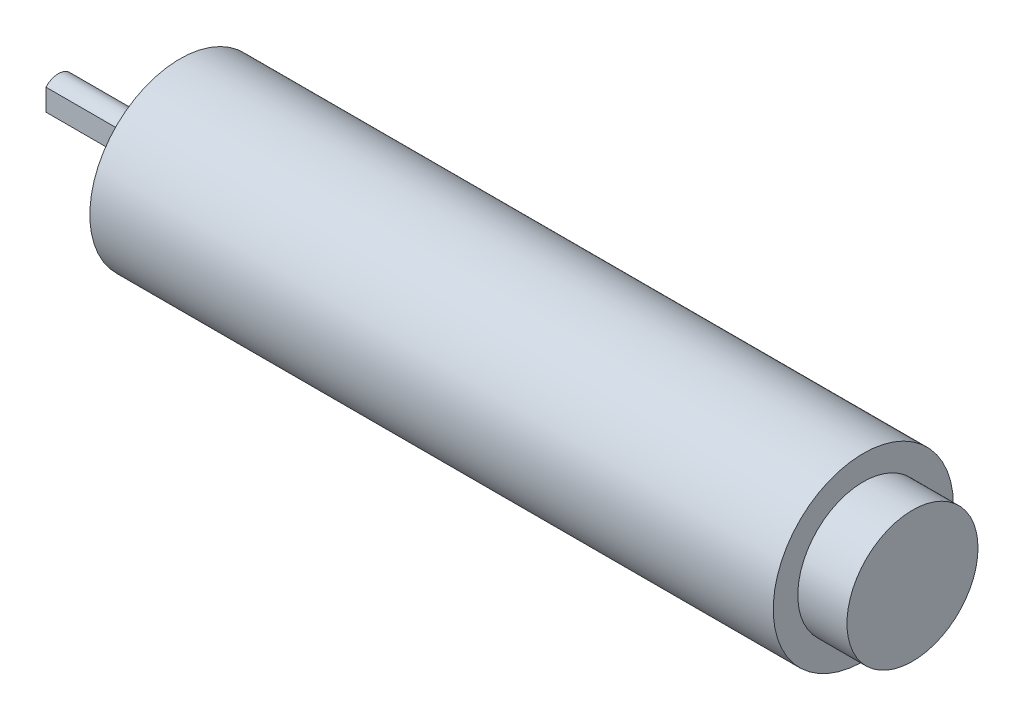
ISO-10303-21;
HEADER;
FILE_DESCRIPTION(('STEP AP214'),'2;1');
FILE_NAME('part.step','',(''),(''),'','','');
FILE_SCHEMA(('AUTOMOTIVE_DESIGN { 1 0 10303 214 1 1 1 1 }'));
ENDSEC;
DATA;
#1=APPLICATION_CONTEXT('core data for automotive mechanical design processes');
#2=APPLICATION_PROTOCOL_DEFINITION('international standard','automotive_design',2000,#1);
#3=PRODUCT_CONTEXT('',#1,'mechanical');
#4=PRODUCT('Part','Part','',(#3));
#5=PRODUCT_RELATED_PRODUCT_CATEGORY('part','',(#4));
#6=PRODUCT_DEFINITION_FORMATION('','',#4);
#7=PRODUCT_DEFINITION_CONTEXT('part definition',#1,'design');
#8=PRODUCT_DEFINITION('design','',#6,#7);
#9=PRODUCT_DEFINITION_SHAPE('','',#8);
#10=(LENGTH_UNIT() NAMED_UNIT(*) SI_UNIT(.MILLI.,.METRE.));
#11=(NAMED_UNIT(*) PLANE_ANGLE_UNIT() SI_UNIT($,.RADIAN.));
#12=(NAMED_UNIT(*) SI_UNIT($,.STERADIAN.) SOLID_ANGLE_UNIT());
#13=UNCERTAINTY_MEASURE_WITH_UNIT(LENGTH_MEASURE(1.E-05),#10,'distance_accuracy_value','');
#14=(GEOMETRIC_REPRESENTATION_CONTEXT(3) GLOBAL_UNCERTAINTY_ASSIGNED_CONTEXT((#13)) GLOBAL_UNIT_ASSIGNED_CONTEXT((#10,
#11,#12)) REPRESENTATION_CONTEXT('',''));
#15=CARTESIAN_POINT('',(0.,0.,0.));
#16=DIRECTION('',(0.,0.,1.));
#17=DIRECTION('',(1.,0.,0.));
#18=AXIS2_PLACEMENT_3D('',#15,#16,#17);
#19=CARTESIAN_POINT('',(0.,0.,0.));
#20=DIRECTION('',(1.,0.,0.));
#21=DIRECTION('',(0.,0.,-1.));
#22=AXIS2_PLACEMENT_3D('',#19,#20,#21);
#23=CYLINDRICAL_SURFACE('',#22,11.);
#24=CARTESIAN_POINT('',(0.,0.,0.));
#25=DIRECTION('',(1.,0.,0.));
#26=DIRECTION('',(0.,0.,-1.));
#27=AXIS2_PLACEMENT_3D('',#24,#25,#26);
#28=CIRCLE('',#27,11.);
#29=CARTESIAN_POINT('',(0.,0.,-11.));
#30=VERTEX_POINT('',#29);
#31=EDGE_CURVE('E11',#30,#30,#28,.T.);
#32=ORIENTED_EDGE('',*,*,#31,.T.);
#33=EDGE_LOOP('',(#32));
#34=FACE_BOUND('',#33,.T.);
#35=CARTESIAN_POINT('',(83.43,0.,0.));
#36=DIRECTION('',(1.,0.,0.));
#37=DIRECTION('',(0.,0.,-1.));
#38=AXIS2_PLACEMENT_3D('',#35,#36,#37);
#39=CIRCLE('',#38,11.);
#40=CARTESIAN_POINT('',(83.43,0.,-11.));
#41=VERTEX_POINT('',#40);
#42=EDGE_CURVE('E40',#41,#41,#39,.F.);
#43=ORIENTED_EDGE('',*,*,#42,.T.);
#44=EDGE_LOOP('',(#43));
#45=FACE_BOUND('',#44,.T.);
#46=ADVANCED_FACE('F37',(#34,#45),#23,.T.);
#47=CARTESIAN_POINT('',(-3.15,0.,0.));
#48=DIRECTION('',(-1.,0.,0.));
#49=DIRECTION('',(0.,0.,1.));
#50=AXIS2_PLACEMENT_3D('',#47,#48,#49);
#51=PLANE('',#50);
#52=CARTESIAN_POINT('',(-3.15,0.,0.));
#53=DIRECTION('',(-1.,0.,0.));
#54=DIRECTION('',(0.,0.,1.));
#55=AXIS2_PLACEMENT_3D('',#52,#53,#54);
#56=CIRCLE('',#55,3.5);
#57=CARTESIAN_POINT('',(-3.15,0.,3.5));
#58=VERTEX_POINT('',#57);
#59=EDGE_CURVE('E88',#58,#58,#56,.T.);
#60=ORIENTED_EDGE('',*,*,#59,.T.);
#61=EDGE_LOOP('',(#60));
#62=FACE_BOUND('',#61,.T.);
#63=CARTESIAN_POINT('',(-3.15,0.,0.));
#64=DIRECTION('',(-1.,0.,0.));
#65=DIRECTION('',(0.,0.,1.));
#66=AXIS2_PLACEMENT_3D('',#63,#64,#65);
#67=CIRCLE('',#66,2.);
#68=CARTESIAN_POINT('',(-3.15,0.,2.));
#69=VERTEX_POINT('',#68);
#70=EDGE_CURVE('E79',#69,#69,#67,.T.);
#71=ORIENTED_EDGE('',*,*,#70,.F.);
#72=EDGE_LOOP('',(#71));
#73=FACE_BOUND('',#72,.T.);
#74=ADVANCED_FACE('F112',(#62,#73),#51,.T.);
#75=CARTESIAN_POINT('',(-1.35,0.,0.));
#76=DIRECTION('',(-1.,0.,0.));
#77=DIRECTION('',(0.,0.,1.));
#78=AXIS2_PLACEMENT_3D('',#75,#76,#77);
#79=PLANE('',#78);
#80=CARTESIAN_POINT('',(-1.35,0.,0.));
#81=DIRECTION('',(-1.,0.,0.));
#82=DIRECTION('',(0.,0.,1.));
#83=AXIS2_PLACEMENT_3D('',#80,#81,#82);
#84=CIRCLE('',#83,5.);
#85=CARTESIAN_POINT('',(-1.35,0.,-5.));
#86=VERTEX_POINT('',#85);
#87=EDGE_CURVE('E46',#86,#86,#84,.T.);
#88=ORIENTED_EDGE('',*,*,#87,.T.);
#89=EDGE_LOOP('',(#88));
#90=FACE_BOUND('',#89,.T.);
#91=CARTESIAN_POINT('',(-1.35,0.,0.));
#92=DIRECTION('',(-1.,0.,0.));
#93=DIRECTION('',(0.,0.,1.));
#94=AXIS2_PLACEMENT_3D('',#91,#92,#93);
#95=CIRCLE('',#94,3.5);
#96=CARTESIAN_POINT('',(-1.35,0.,3.5));
#97=VERTEX_POINT('',#96);
#98=EDGE_CURVE('E85',#97,#97,#95,.T.);
#99=ORIENTED_EDGE('',*,*,#98,.F.);
#100=EDGE_LOOP('',(#99));
#101=FACE_BOUND('',#100,.T.);
#102=ADVANCED_FACE('F103',(#90,#101),#79,.T.);
#103=CARTESIAN_POINT('',(0.,11.,0.));
#104=DIRECTION('',(-1.,0.,0.));
#105=DIRECTION('',(0.,0.,1.));
#106=AXIS2_PLACEMENT_3D('',#103,#104,#105);
#107=PLANE('',#106);
#108=CARTESIAN_POINT('',(0.,6.06217782649,-3.5));
#109=DIRECTION('',(-1.,0.,0.));
#110=DIRECTION('',(0.,0.,1.));
#111=AXIS2_PLACEMENT_3D('',#108,#109,#110);
#112=CIRCLE('',#111,0.975000000000014);
#113=CARTESIAN_POINT('',(0.,6.06217782649,-2.52499999999999));
#114=VERTEX_POINT('',#113);
#115=EDGE_CURVE('E162',#114,#114,#112,.T.);
#116=ORIENTED_EDGE('',*,*,#115,.F.);
#117=EDGE_LOOP('',(#116));
#118=FACE_BOUND('',#117,.T.);
#119=CARTESIAN_POINT('',(0.,-6.06217782649,-3.5));
#120=DIRECTION('',(-1.,0.,0.));
#121=DIRECTION('',(0.,0.,1.));
#122=AXIS2_PLACEMENT_3D('',#119,#120,#121);
#123=CIRCLE('',#122,0.975000000000014);
#124=CARTESIAN_POINT('',(0.,-6.06217782649,-2.52499999999999));
#125=VERTEX_POINT('',#124);
#126=EDGE_CURVE('E168',#125,#125,#123,.T.);
#127=ORIENTED_EDGE('',*,*,#126,.F.);
#128=EDGE_LOOP('',(#127));
#129=FACE_BOUND('',#128,.T.);
#130=CARTESIAN_POINT('',(0.,0.,7.));
#131=DIRECTION('',(-1.,0.,0.));
#132=DIRECTION('',(0.,0.,1.));
#133=AXIS2_PLACEMENT_3D('',#130,#131,#132);
#134=CIRCLE('',#133,0.975000000000014);
#135=CARTESIAN_POINT('',(0.,0.,7.97500000000001));
#136=VERTEX_POINT('',#135);
#137=EDGE_CURVE('E174',#136,#136,#134,.T.);
#138=ORIENTED_EDGE('',*,*,#137,.F.);
#139=EDGE_LOOP('',(#138));
#140=FACE_BOUND('',#139,.T.);
#141=ORIENTED_EDGE('',*,*,#31,.F.);
#142=EDGE_LOOP('',(#141));
#143=FACE_BOUND('',#142,.T.);
#144=CARTESIAN_POINT('',(0.,0.,0.));
#145=DIRECTION('',(-1.,0.,0.));
#146=DIRECTION('',(0.,0.,1.));
#147=AXIS2_PLACEMENT_3D('',#144,#145,#146);
#148=CIRCLE('',#147,5.);
#149=CARTESIAN_POINT('',(0.,0.,-5.));
#150=VERTEX_POINT('',#149);
#151=EDGE_CURVE('E91',#150,#150,#148,.T.);
#152=ORIENTED_EDGE('',*,*,#151,.F.);
#153=EDGE_LOOP('',(#152));
#154=FACE_BOUND('',#153,.T.);
#155=ADVANCED_FACE('F101',(#118,#129,#140,#143,#154),#107,.T.);
#156=CARTESIAN_POINT('',(-1.35,0.,0.));
#157=DIRECTION('',(1.,0.,0.));
#158=DIRECTION('',(0.,0.,-1.));
#159=AXIS2_PLACEMENT_3D('',#156,#157,#158);
#160=CYLINDRICAL_SURFACE('',#159,5.);
#161=CARTESIAN_POINT('',(-1.35,0.,-5.));
#162=CARTESIAN_POINT('',(-1.3359375,0.,-5.));
#163=CARTESIAN_POINT('',(-1.321875,0.,-5.));
#164=CARTESIAN_POINT('',(-1.29375,0.,-5.));
#165=CARTESIAN_POINT('',(-1.2796875,0.,-5.));
#166=CARTESIAN_POINT('',(-1.2515625,0.,-5.));
#167=CARTESIAN_POINT('',(-1.2375,0.,-5.));
#168=CARTESIAN_POINT('',(-1.209375,0.,-5.));
#169=CARTESIAN_POINT('',(-1.1953125,0.,-5.));
#170=CARTESIAN_POINT('',(-1.1671875,0.,-5.));
#171=CARTESIAN_POINT('',(-1.153125,0.,-5.));
#172=CARTESIAN_POINT('',(-1.125,0.,-5.));
#173=CARTESIAN_POINT('',(-1.1109375,0.,-5.));
#174=CARTESIAN_POINT('',(-1.0828125,0.,-5.));
#175=CARTESIAN_POINT('',(-1.06875,0.,-5.));
#176=CARTESIAN_POINT('',(-1.040625,0.,-5.));
#177=CARTESIAN_POINT('',(-1.0265625,0.,-5.));
#178=CARTESIAN_POINT('',(-0.9984375,0.,-5.));
#179=CARTESIAN_POINT('',(-0.984375,0.,-5.));
#180=CARTESIAN_POINT('',(-0.95625,0.,-5.));
#181=CARTESIAN_POINT('',(-0.9421875,0.,-5.));
#182=CARTESIAN_POINT('',(-0.9140625,0.,-5.));
#183=CARTESIAN_POINT('',(-0.9,0.,-5.));
#184=CARTESIAN_POINT('',(-0.871875,0.,-5.));
#185=CARTESIAN_POINT('',(-0.8578125,0.,-5.));
#186=CARTESIAN_POINT('',(-0.8296875,0.,-5.));
#187=CARTESIAN_POINT('',(-0.815625,0.,-5.));
#188=CARTESIAN_POINT('',(-0.7875,0.,-5.));
#189=CARTESIAN_POINT('',(-0.7734375,0.,-5.));
#190=CARTESIAN_POINT('',(-0.7453125,0.,-5.));
#191=CARTESIAN_POINT('',(-0.73125,0.,-5.));
#192=CARTESIAN_POINT('',(-0.703125,0.,-5.));
#193=CARTESIAN_POINT('',(-0.6890625,0.,-5.));
#194=CARTESIAN_POINT('',(-0.6609375,0.,-5.));
#195=CARTESIAN_POINT('',(-0.646875,0.,-5.));
#196=CARTESIAN_POINT('',(-0.61875,0.,-5.));
#197=CARTESIAN_POINT('',(-0.6046875,0.,-5.));
#198=CARTESIAN_POINT('',(-0.5765625,0.,-5.));
#199=CARTESIAN_POINT('',(-0.5625,0.,-5.));
#200=CARTESIAN_POINT('',(-0.534375,0.,-5.));
#201=CARTESIAN_POINT('',(-0.5203125,0.,-5.));
#202=CARTESIAN_POINT('',(-0.4921875,0.,-5.));
#203=CARTESIAN_POINT('',(-0.478125,0.,-5.));
#204=CARTESIAN_POINT('',(-0.45,0.,-5.));
#205=CARTESIAN_POINT('',(-0.4359375,0.,-5.));
#206=CARTESIAN_POINT('',(-0.4078125,0.,-5.));
#207=CARTESIAN_POINT('',(-0.39375,0.,-5.));
#208=CARTESIAN_POINT('',(-0.365625,0.,-5.));
#209=CARTESIAN_POINT('',(-0.3515625,0.,-5.));
#210=CARTESIAN_POINT('',(-0.3234375,0.,-5.));
#211=CARTESIAN_POINT('',(-0.309375,0.,-5.));
#212=CARTESIAN_POINT('',(-0.28125,0.,-5.));
#213=CARTESIAN_POINT('',(-0.2671875,0.,-5.));
#214=CARTESIAN_POINT('',(-0.2390625,0.,-5.));
#215=CARTESIAN_POINT('',(-0.225,0.,-5.));
#216=CARTESIAN_POINT('',(-0.196875,0.,-5.));
#217=CARTESIAN_POINT('',(-0.1828125,0.,-5.));
#218=CARTESIAN_POINT('',(-0.1546875,0.,-5.));
#219=CARTESIAN_POINT('',(-0.140625,0.,-5.));
#220=CARTESIAN_POINT('',(-0.1125,0.,-5.));
#221=CARTESIAN_POINT('',(-0.0984374999999998,0.,-5.));
#222=CARTESIAN_POINT('',(-0.0703124999999998,0.,-5.));
#223=CARTESIAN_POINT('',(-0.0562499999999997,0.,-5.));
#224=CARTESIAN_POINT('',(-0.0281249999999997,0.,-5.));
#225=CARTESIAN_POINT('',(-0.0140624999999997,0.,-5.));
#226=CARTESIAN_POINT('',(0.,0.,-5.));
#227=B_SPLINE_CURVE_WITH_KNOTS('',3,(#161,#162,#163,#164,#165,#166,#167,#168,#169,#170,#171,
#172,#173,#174,#175,#176,#177,#178,#179,#180,#181,#182,#183,#184,#185,#186,#187,#188,#189,#190,
#191,#192,#193,#194,#195,#196,#197,#198,#199,#200,#201,#202,#203,#204,#205,#206,#207,#208,#209,
#210,#211,#212,#213,#214,#215,#216,#217,#218,#219,#220,#221,#222,#223,#224,#225,#226),
.UNSPECIFIED.,.F.,.F.,(4,2,2,2,2,2,2,2,2,2,2,2,2,2,2,2,2,2,2,2,2,2,2,2,2,2,2,2,2,2,2,2,4),(0.,
0.0421875000000001,0.084375,0.1265625,0.16875,0.2109375,0.253125,0.2953125,0.3375,0.3796875,
0.421875,0.4640625,0.50625,0.5484375,0.590625,0.6328125,0.675,0.7171875,0.759375,0.8015625,
0.84375,0.8859375,0.928125,0.9703125,1.0125,1.0546875,1.096875,1.1390625,1.18125,1.2234375,
1.265625,1.3078125,1.35),.UNSPECIFIED.);
#228=EDGE_CURVE('BSEAM99',#86,#150,#227,.T.);
#229=ORIENTED_EDGE('',*,*,#87,.F.);
#230=ORIENTED_EDGE('',*,*,#151,.T.);
#231=ORIENTED_EDGE('',*,*,#228,.T.);
#232=ORIENTED_EDGE('',*,*,#228,.F.);
#233=EDGE_LOOP('',(#229,#231,#230,#232));
#234=FACE_BOUND('',#233,.T.);
#235=ADVANCED_FACE('F99',(#234),#160,.T.);
#236=CARTESIAN_POINT('',(-3.15,0.,0.));
#237=DIRECTION('',(1.,0.,0.));
#238=DIRECTION('',(0.,0.,-1.));
#239=AXIS2_PLACEMENT_3D('',#236,#237,#238);
#240=CYLINDRICAL_SURFACE('',#239,3.5);
#241=ORIENTED_EDGE('',*,*,#59,.F.);
#242=EDGE_LOOP('',(#241));
#243=FACE_BOUND('',#242,.T.);
#244=ORIENTED_EDGE('',*,*,#98,.T.);
#245=EDGE_LOOP('',(#244));
#246=FACE_BOUND('',#245,.T.);
#247=ADVANCED_FACE('F109',(#243,#246),#240,.T.);
#248=CARTESIAN_POINT('',(-14.85,0.,0.));
#249=DIRECTION('',(1.,0.,0.));
#250=DIRECTION('',(0.,0.,-1.));
#251=AXIS2_PLACEMENT_3D('',#248,#249,#250);
#252=CYLINDRICAL_SURFACE('',#251,2.);
#253=CARTESIAN_POINT('',(-14.85,0.,0.));
#254=DIRECTION('',(-1.,0.,0.));
#255=DIRECTION('',(0.,0.,1.));
#256=AXIS2_PLACEMENT_3D('',#253,#254,#255);
#257=CIRCLE('',#256,2.);
#258=CARTESIAN_POINT('',(-14.85,1.32287565553165,1.50000000000057));
#259=VERTEX_POINT('',#258);
#260=CARTESIAN_POINT('',(-14.85,-1.32287565553165,1.50000000000057));
#261=VERTEX_POINT('',#260);
#262=EDGE_CURVE('E83',#259,#261,#257,.T.);
#263=ORIENTED_EDGE('',*,*,#262,.F.);
#264=DIRECTION('',(-1.,0.,0.));
#265=VECTOR('',#264,1.);
#266=CARTESIAN_POINT('',(-2.34976552175177,1.32287565553165,1.50000000000057));
#267=LINE('',#266,#265);
#268=CARTESIAN_POINT('',(-5.84999999999943,1.32287565553165,1.50000000000057));
#269=VERTEX_POINT('',#268);
#270=EDGE_CURVE('E53',#269,#259,#267,.T.);
#271=ORIENTED_EDGE('',*,*,#270,.F.);
#272=CARTESIAN_POINT('',(-7.35,0.,0.));
#273=DIRECTION('',(0.707106781186547,0.,-0.707106781186548));
#274=DIRECTION('',(-0.707106781186548,0.,-0.707106781186547));
#275=AXIS2_PLACEMENT_3D('',#272,#273,#274);
#276=ELLIPSE('',#275,2.82842712474619,2.);
#277=CARTESIAN_POINT('',(-5.84999999999943,-1.32287565553165,1.50000000000057));
#278=VERTEX_POINT('',#277);
#279=EDGE_CURVE('E71',#278,#269,#276,.F.);
#280=ORIENTED_EDGE('',*,*,#279,.F.);
#281=DIRECTION('',(-1.,0.,0.));
#282=VECTOR('',#281,1.);
#283=CARTESIAN_POINT('',(-2.34976552175177,-1.32287565553165,1.50000000000057));
#284=LINE('',#283,#282);
#285=EDGE_CURVE('E62',#278,#261,#284,.T.);
#286=ORIENTED_EDGE('',*,*,#285,.T.);
#287=EDGE_LOOP('',(#263,#271,#280,#286));
#288=FACE_BOUND('',#287,.T.);
#289=ORIENTED_EDGE('',*,*,#70,.T.);
#290=EDGE_LOOP('',(#289));
#291=FACE_BOUND('',#290,.T.);
#292=ADVANCED_FACE('F76',(#288,#291),#252,.T.);
#293=CARTESIAN_POINT('',(-14.85,0.,0.));
#294=DIRECTION('',(-1.,0.,0.));
#295=DIRECTION('',(0.,0.,1.));
#296=AXIS2_PLACEMENT_3D('',#293,#294,#295);
#297=PLANE('',#296);
#298=DIRECTION('',(0.,-1.,0.));
#299=VECTOR('',#298,1.);
#300=CARTESIAN_POINT('',(-14.85,1.32287565553165,1.50000000000057));
#301=LINE('',#300,#299);
#302=EDGE_CURVE('E58',#259,#261,#301,.T.);
#303=ORIENTED_EDGE('',*,*,#302,.F.);
#304=ORIENTED_EDGE('',*,*,#262,.T.);
#305=EDGE_LOOP('',(#303,#304));
#306=FACE_BOUND('',#305,.T.);
#307=ADVANCED_FACE('F205',(#306),#297,.T.);
#308=CARTESIAN_POINT('',(-3.675,0.,3.675));
#309=DIRECTION('',(0.707106781186547,0.,-0.707106781186548));
#310=DIRECTION('',(-0.707106781186548,0.,-0.707106781186547));
#311=AXIS2_PLACEMENT_3D('',#308,#309,#310);
#312=PLANE('',#311);
#313=ORIENTED_EDGE('',*,*,#279,.T.);
#314=DIRECTION('',(0.,-1.,0.));
#315=VECTOR('',#314,1.);
#316=CARTESIAN_POINT('',(-5.84999999999943,1.32287565553165,1.50000000000057));
#317=LINE('',#316,#315);
#318=EDGE_CURVE('E65',#269,#278,#317,.T.);
#319=ORIENTED_EDGE('',*,*,#318,.T.);
#320=EDGE_LOOP('',(#313,#319));
#321=FACE_BOUND('',#320,.T.);
#322=ADVANCED_FACE('F74',(#321),#312,.F.);
#323=CARTESIAN_POINT('',(-2.34976552175177,1.32287565553165,1.50000000000057));
#324=DIRECTION('',(0.,0.,-1.));
#325=DIRECTION('',(0.,1.,0.));
#326=AXIS2_PLACEMENT_3D('',#323,#324,#325);
#327=PLANE('',#326);
#328=ORIENTED_EDGE('',*,*,#270,.T.);
#329=ORIENTED_EDGE('',*,*,#302,.T.);
#330=ORIENTED_EDGE('',*,*,#285,.F.);
#331=ORIENTED_EDGE('',*,*,#318,.F.);
#332=EDGE_LOOP('',(#328,#329,#330,#331));
#333=FACE_BOUND('',#332,.T.);
#334=ADVANCED_FACE('F64',(#333),#327,.F.);
#335=CARTESIAN_POINT('',(6.50000000000001,0.,7.));
#336=DIRECTION('',(1.,0.,0.));
#337=DIRECTION('',(0.,0.,-1.));
#338=AXIS2_PLACEMENT_3D('',#335,#336,#337);
#339=PLANE('',#338);
#340=CARTESIAN_POINT('',(6.50000000000001,0.,7.));
#341=DIRECTION('',(-1.,0.,0.));
#342=DIRECTION('',(0.,0.,1.));
#343=AXIS2_PLACEMENT_3D('',#340,#341,#342);
#344=CIRCLE('',#343,0.975000000000014);
#345=CARTESIAN_POINT('',(6.50000000000001,0.,7.97500000000001));
#346=VERTEX_POINT('',#345);
#347=EDGE_CURVE('E177',#346,#346,#344,.T.);
#348=ORIENTED_EDGE('',*,*,#347,.T.);
#349=EDGE_LOOP('',(#348));
#350=FACE_BOUND('',#349,.T.);
#351=ADVANCED_FACE('F181',(#350),#339,.F.);
#352=CARTESIAN_POINT('',(0.,0.,7.));
#353=DIRECTION('',(-1.,0.,0.));
#354=DIRECTION('',(0.,0.,1.));
#355=AXIS2_PLACEMENT_3D('',#352,#353,#354);
#356=CYLINDRICAL_SURFACE('',#355,0.975000000000014);
#357=ORIENTED_EDGE('',*,*,#347,.F.);
#358=EDGE_LOOP('',(#357));
#359=FACE_BOUND('',#358,.T.);
#360=ORIENTED_EDGE('',*,*,#137,.T.);
#361=EDGE_LOOP('',(#360));
#362=FACE_BOUND('',#361,.T.);
#363=ADVANCED_FACE('F183',(#359,#362),#356,.F.);
#364=CARTESIAN_POINT('',(6.50000000000001,-6.06217782649,-3.5));
#365=DIRECTION('',(1.,0.,0.));
#366=DIRECTION('',(0.,0.,-1.));
#367=AXIS2_PLACEMENT_3D('',#364,#365,#366);
#368=PLANE('',#367);
#369=CARTESIAN_POINT('',(6.50000000000001,-6.06217782649,-3.5));
#370=DIRECTION('',(-1.,0.,0.));
#371=DIRECTION('',(0.,0.,1.));
#372=AXIS2_PLACEMENT_3D('',#369,#370,#371);
#373=CIRCLE('',#372,0.975000000000014);
#374=CARTESIAN_POINT('',(6.50000000000001,-6.06217782649,-2.52499999999999));
#375=VERTEX_POINT('',#374);
#376=EDGE_CURVE('E171',#375,#375,#373,.T.);
#377=ORIENTED_EDGE('',*,*,#376,.T.);
#378=EDGE_LOOP('',(#377));
#379=FACE_BOUND('',#378,.T.);
#380=ADVANCED_FACE('F186',(#379),#368,.F.);
#381=CARTESIAN_POINT('',(0.,-6.06217782649,-3.5));
#382=DIRECTION('',(-1.,0.,0.));
#383=DIRECTION('',(0.,0.,1.));
#384=AXIS2_PLACEMENT_3D('',#381,#382,#383);
#385=CYLINDRICAL_SURFACE('',#384,0.975000000000014);
#386=ORIENTED_EDGE('',*,*,#376,.F.);
#387=EDGE_LOOP('',(#386));
#388=FACE_BOUND('',#387,.T.);
#389=ORIENTED_EDGE('',*,*,#126,.T.);
#390=EDGE_LOOP('',(#389));
#391=FACE_BOUND('',#390,.T.);
#392=ADVANCED_FACE('F195',(#388,#391),#385,.F.);
#393=CARTESIAN_POINT('',(6.50000000000001,6.06217782649,-3.5));
#394=DIRECTION('',(1.,0.,0.));
#395=DIRECTION('',(0.,0.,-1.));
#396=AXIS2_PLACEMENT_3D('',#393,#394,#395);
#397=PLANE('',#396);
#398=CARTESIAN_POINT('',(6.50000000000001,6.06217782649,-3.5));
#399=DIRECTION('',(-1.,0.,0.));
#400=DIRECTION('',(0.,0.,1.));
#401=AXIS2_PLACEMENT_3D('',#398,#399,#400);
#402=CIRCLE('',#401,0.975000000000014);
#403=CARTESIAN_POINT('',(6.50000000000001,6.06217782649,-2.52499999999999));
#404=VERTEX_POINT('',#403);
#405=EDGE_CURVE('E165',#404,#404,#402,.T.);
#406=ORIENTED_EDGE('',*,*,#405,.T.);
#407=EDGE_LOOP('',(#406));
#408=FACE_BOUND('',#407,.T.);
#409=ADVANCED_FACE('F263',(#408),#397,.F.);
#410=CARTESIAN_POINT('',(0.,6.06217782649,-3.5));
#411=DIRECTION('',(-1.,0.,0.));
#412=DIRECTION('',(0.,0.,1.));
#413=AXIS2_PLACEMENT_3D('',#410,#411,#412);
#414=CYLINDRICAL_SURFACE('',#413,0.975000000000014);
#415=ORIENTED_EDGE('',*,*,#405,.F.);
#416=EDGE_LOOP('',(#415));
#417=FACE_BOUND('',#416,.T.);
#418=ORIENTED_EDGE('',*,*,#115,.T.);
#419=EDGE_LOOP('',(#418));
#420=FACE_BOUND('',#419,.T.);
#421=ADVANCED_FACE('F278',(#417,#420),#414,.F.);
#422=CARTESIAN_POINT('',(83.43,0.,0.));
#423=DIRECTION('',(1.,0.,0.));
#424=DIRECTION('',(0.,0.,-1.));
#425=AXIS2_PLACEMENT_3D('',#422,#423,#424);
#426=PLANE('',#425);
#427=ORIENTED_EDGE('',*,*,#42,.F.);
#428=EDGE_LOOP('',(#427));
#429=FACE_BOUND('',#428,.T.);
#430=CARTESIAN_POINT('',(83.43,0.,0.));
#431=DIRECTION('',(1.,0.,0.));
#432=DIRECTION('',(0.,0.,-1.));
#433=AXIS2_PLACEMENT_3D('',#430,#431,#432);
#434=CIRCLE('',#433,8.00000000000001);
#435=CARTESIAN_POINT('',(83.43,0.,-8.00000000000001));
#436=VERTEX_POINT('',#435);
#437=EDGE_CURVE('E130',#436,#436,#434,.T.);
#438=ORIENTED_EDGE('',*,*,#437,.F.);
#439=EDGE_LOOP('',(#438));
#440=FACE_BOUND('',#439,.T.);
#441=ADVANCED_FACE('F288',(#429,#440),#426,.T.);
#442=CARTESIAN_POINT('',(83.43,0.,0.));
#443=DIRECTION('',(1.,0.,0.));
#444=DIRECTION('',(0.,0.,-1.));
#445=AXIS2_PLACEMENT_3D('',#442,#443,#444);
#446=CYLINDRICAL_SURFACE('',#445,8.00000000000001);
#447=ORIENTED_EDGE('',*,*,#437,.T.);
#448=EDGE_LOOP('',(#447));
#449=FACE_BOUND('',#448,.T.);
#450=CARTESIAN_POINT('',(89.43,0.,0.));
#451=DIRECTION('',(1.,0.,0.));
#452=DIRECTION('',(0.,0.,-1.));
#453=AXIS2_PLACEMENT_3D('',#450,#451,#452);
#454=CIRCLE('',#453,8.00000000000001);
#455=CARTESIAN_POINT('',(89.43,0.,-8.00000000000001));
#456=VERTEX_POINT('',#455);
#457=EDGE_CURVE('E135',#456,#456,#454,.T.);
#458=ORIENTED_EDGE('',*,*,#457,.F.);
#459=EDGE_LOOP('',(#458));
#460=FACE_BOUND('',#459,.T.);
#461=ADVANCED_FACE('F429',(#449,#460),#446,.T.);
#462=CARTESIAN_POINT('',(89.43,0.,0.));
#463=DIRECTION('',(1.,0.,0.));
#464=DIRECTION('',(0.,0.,-1.));
#465=AXIS2_PLACEMENT_3D('',#462,#463,#464);
#466=PLANE('',#465);
#467=ORIENTED_EDGE('',*,*,#457,.T.);
#468=EDGE_LOOP('',(#467));
#469=FACE_BOUND('',#468,.T.);
#470=ADVANCED_FACE('F438',(#469),#466,.T.);
#471=CLOSED_SHELL('',(#46,#74,#102,#155,#235,#247,#292,#307,#322,#334,#351,#363,#380,#392,#409,
#421,#441,#461,#470));
#472=CARTESIAN_POINT('',(46.2,0.,0.));
#473=DIRECTION('',(-1.,0.,0.));
#474=DIRECTION('',(0.,0.,1.));
#475=AXIS2_PLACEMENT_3D('',#472,#473,#474);
#476=PLANE('',#475);
#477=CARTESIAN_POINT('',(46.2,0.,0.));
#478=DIRECTION('',(1.,0.,0.));
#479=DIRECTION('',(0.,0.,-1.));
#480=AXIS2_PLACEMENT_3D('',#477,#478,#479);
#481=CIRCLE('',#480,3.50000000000001);
#482=CARTESIAN_POINT('',(46.2,0.,-3.50000000000001));
#483=VERTEX_POINT('',#482);
#484=EDGE_CURVE('E159',#483,#483,#481,.T.);
#485=ORIENTED_EDGE('',*,*,#484,.T.);
#486=EDGE_LOOP('',(#485));
#487=FACE_BOUND('',#486,.T.);
#488=ADVANCED_FACE('F296',(#487),#476,.F.);
#489=CARTESIAN_POINT('',(52.6,0.,0.));
#490=DIRECTION('',(1.,0.,0.));
#491=DIRECTION('',(0.,0.,-1.));
#492=AXIS2_PLACEMENT_3D('',#489,#490,#491);
#493=CYLINDRICAL_SURFACE('',#492,3.50000000000001);
#494=ORIENTED_EDGE('',*,*,#484,.F.);
#495=EDGE_LOOP('',(#494));
#496=FACE_BOUND('',#495,.T.);
#497=CARTESIAN_POINT('',(52.6,0.,0.));
#498=DIRECTION('',(1.,0.,0.));
#499=DIRECTION('',(0.,0.,-1.));
#500=AXIS2_PLACEMENT_3D('',#497,#498,#499);
#501=CIRCLE('',#500,3.50000000000001);
#502=CARTESIAN_POINT('',(52.6,0.,-3.50000000000001));
#503=VERTEX_POINT('',#502);
#504=EDGE_CURVE('E147',#503,#503,#501,.F.);
#505=ORIENTED_EDGE('',*,*,#504,.F.);
#506=EDGE_LOOP('',(#505));
#507=FACE_BOUND('',#506,.T.);
#508=ADVANCED_FACE('F300',(#496,#507),#493,.F.);
#509=CARTESIAN_POINT('',(52.6,0.,0.));
#510=DIRECTION('',(1.,0.,0.));
#511=DIRECTION('',(0.,0.,-1.));
#512=AXIS2_PLACEMENT_3D('',#509,#510,#511);
#513=PLANE('',#512);
#514=ORIENTED_EDGE('',*,*,#504,.T.);
#515=EDGE_LOOP('',(#514));
#516=FACE_BOUND('',#515,.T.);
#517=ADVANCED_FACE('F312',(#516),#513,.F.);
#518=CLOSED_SHELL('',(#488,#508,#517));
#519=CARTESIAN_POINT('',(49.6,0.,8.5));
#520=DIRECTION('',(-1.,0.,0.));
#521=DIRECTION('',(0.,0.,1.));
#522=AXIS2_PLACEMENT_3D('',#519,#520,#521);
#523=PLANE('',#522);
#524=CARTESIAN_POINT('',(49.6,0.,8.5));
#525=DIRECTION('',(1.,0.,0.));
#526=DIRECTION('',(0.,0.,-1.));
#527=AXIS2_PLACEMENT_3D('',#524,#525,#526);
#528=CIRCLE('',#527,1.05000000000001);
#529=CARTESIAN_POINT('',(49.6,0.,7.44999999999999));
#530=VERTEX_POINT('',#529);
#531=EDGE_CURVE('E156',#530,#530,#528,.T.);
#532=ORIENTED_EDGE('',*,*,#531,.T.);
#533=EDGE_LOOP('',(#532));
#534=FACE_BOUND('',#533,.T.);
#535=ADVANCED_FACE('F320',(#534),#523,.F.);
#536=CARTESIAN_POINT('',(52.6,0.,8.5));
#537=DIRECTION('',(1.,0.,0.));
#538=DIRECTION('',(0.,0.,-1.));
#539=AXIS2_PLACEMENT_3D('',#536,#537,#538);
#540=CYLINDRICAL_SURFACE('',#539,1.05000000000001);
#541=ORIENTED_EDGE('',*,*,#531,.F.);
#542=EDGE_LOOP('',(#541));
#543=FACE_BOUND('',#542,.T.);
#544=CARTESIAN_POINT('',(52.6,0.,8.5));
#545=DIRECTION('',(1.,0.,0.));
#546=DIRECTION('',(0.,0.,-1.));
#547=AXIS2_PLACEMENT_3D('',#544,#545,#546);
#548=CIRCLE('',#547,1.05000000000001);
#549=CARTESIAN_POINT('',(52.6,0.,7.44999999999999));
#550=VERTEX_POINT('',#549);
#551=EDGE_CURVE('E144',#550,#550,#548,.F.);
#552=ORIENTED_EDGE('',*,*,#551,.F.);
#553=EDGE_LOOP('',(#552));
#554=FACE_BOUND('',#553,.T.);
#555=ADVANCED_FACE('F324',(#543,#554),#540,.F.);
#556=ORIENTED_EDGE('',*,*,#551,.T.);
#557=EDGE_LOOP('',(#556));
#558=FACE_BOUND('',#557,.T.);
#559=ADVANCED_FACE('F336',(#558),#513,.F.);
#560=CLOSED_SHELL('',(#535,#555,#559));
#561=CARTESIAN_POINT('',(49.6,-7.36121593217,-4.25));
#562=DIRECTION('',(-1.,0.,0.));
#563=DIRECTION('',(0.,0.,1.));
#564=AXIS2_PLACEMENT_3D('',#561,#562,#563);
#565=PLANE('',#564);
#566=CARTESIAN_POINT('',(49.6,-7.36121593217,-4.25));
#567=DIRECTION('',(1.,0.,0.));
#568=DIRECTION('',(0.,0.,-1.));
#569=AXIS2_PLACEMENT_3D('',#566,#567,#568);
#570=CIRCLE('',#569,1.05000000000001);
#571=CARTESIAN_POINT('',(49.6,-7.36121593217,-5.30000000000001));
#572=VERTEX_POINT('',#571);
#573=EDGE_CURVE('E153',#572,#572,#570,.T.);
#574=ORIENTED_EDGE('',*,*,#573,.T.);
#575=EDGE_LOOP('',(#574));
#576=FACE_BOUND('',#575,.T.);
#577=ADVANCED_FACE('F344',(#576),#565,.F.);
#578=CARTESIAN_POINT('',(52.6,-7.36121593217,-4.25));
#579=DIRECTION('',(1.,0.,0.));
#580=DIRECTION('',(0.,0.,-1.));
#581=AXIS2_PLACEMENT_3D('',#578,#579,#580);
#582=CYLINDRICAL_SURFACE('',#581,1.05000000000001);
#583=ORIENTED_EDGE('',*,*,#573,.F.);
#584=EDGE_LOOP('',(#583));
#585=FACE_BOUND('',#584,.T.);
#586=CARTESIAN_POINT('',(52.6,-7.36121593217,-4.25));
#587=DIRECTION('',(1.,0.,0.));
#588=DIRECTION('',(0.,0.,-1.));
#589=AXIS2_PLACEMENT_3D('',#586,#587,#588);
#590=CIRCLE('',#589,1.05000000000001);
#591=CARTESIAN_POINT('',(52.6,-7.36121593217,-5.30000000000001));
#592=VERTEX_POINT('',#591);
#593=EDGE_CURVE('E132',#592,#592,#590,.F.);
#594=ORIENTED_EDGE('',*,*,#593,.F.);
#595=EDGE_LOOP('',(#594));
#596=FACE_BOUND('',#595,.T.);
#597=ADVANCED_FACE('F348',(#585,#596),#582,.F.);
#598=ORIENTED_EDGE('',*,*,#593,.T.);
#599=EDGE_LOOP('',(#598));
#600=FACE_BOUND('',#599,.T.);
#601=ADVANCED_FACE('F360',(#600),#513,.F.);
#602=CLOSED_SHELL('',(#577,#597,#601));
#603=CARTESIAN_POINT('',(49.6,7.36121593217,-4.25));
#604=DIRECTION('',(-1.,0.,0.));
#605=DIRECTION('',(0.,0.,1.));
#606=AXIS2_PLACEMENT_3D('',#603,#604,#605);
#607=PLANE('',#606);
#608=CARTESIAN_POINT('',(49.6,7.36121593217,-4.25));
#609=DIRECTION('',(1.,0.,0.));
#610=DIRECTION('',(0.,0.,-1.));
#611=AXIS2_PLACEMENT_3D('',#608,#609,#610);
#612=CIRCLE('',#611,1.05000000000001);
#613=CARTESIAN_POINT('',(49.6,7.36121593217,-5.30000000000001));
#614=VERTEX_POINT('',#613);
#615=EDGE_CURVE('E150',#614,#614,#612,.T.);
#616=ORIENTED_EDGE('',*,*,#615,.T.);
#617=EDGE_LOOP('',(#616));
#618=FACE_BOUND('',#617,.T.);
#619=ADVANCED_FACE('F368',(#618),#607,.F.);
#620=CARTESIAN_POINT('',(52.6,7.36121593217,-4.25));
#621=DIRECTION('',(1.,0.,0.));
#622=DIRECTION('',(0.,0.,-1.));
#623=AXIS2_PLACEMENT_3D('',#620,#621,#622);
#624=CYLINDRICAL_SURFACE('',#623,1.05000000000001);
#625=ORIENTED_EDGE('',*,*,#615,.F.);
#626=EDGE_LOOP('',(#625));
#627=FACE_BOUND('',#626,.T.);
#628=CARTESIAN_POINT('',(52.6,7.36121593217,-4.25));
#629=DIRECTION('',(1.,0.,0.));
#630=DIRECTION('',(0.,0.,-1.));
#631=AXIS2_PLACEMENT_3D('',#628,#629,#630);
#632=CIRCLE('',#631,1.05000000000001);
#633=CARTESIAN_POINT('',(52.6,7.36121593217,-5.30000000000001));
#634=VERTEX_POINT('',#633);
#635=EDGE_CURVE('E129',#634,#634,#632,.F.);
#636=ORIENTED_EDGE('',*,*,#635,.F.);
#637=EDGE_LOOP('',(#636));
#638=FACE_BOUND('',#637,.T.);
#639=ADVANCED_FACE('F372',(#627,#638),#624,.F.);
#640=ORIENTED_EDGE('',*,*,#635,.T.);
#641=EDGE_LOOP('',(#640));
#642=FACE_BOUND('',#641,.T.);
#643=ADVANCED_FACE('F384',(#642),#513,.F.);
#644=CLOSED_SHELL('',(#619,#639,#643));
#645=ORIENTED_CLOSED_SHELL('',*,#518,.T.);
#646=ORIENTED_CLOSED_SHELL('',*,#560,.T.);
#647=ORIENTED_CLOSED_SHELL('',*,#602,.T.);
#648=ORIENTED_CLOSED_SHELL('',*,#644,.T.);
#649=BREP_WITH_VOIDS('B2',#471,(#645,#646,#647,#648));
#650=ADVANCED_BREP_SHAPE_REPRESENTATION('',(#18,#649),#14);
#651=SHAPE_DEFINITION_REPRESENTATION(#9,#650);
ENDSEC;
END-ISO-10303-21;
